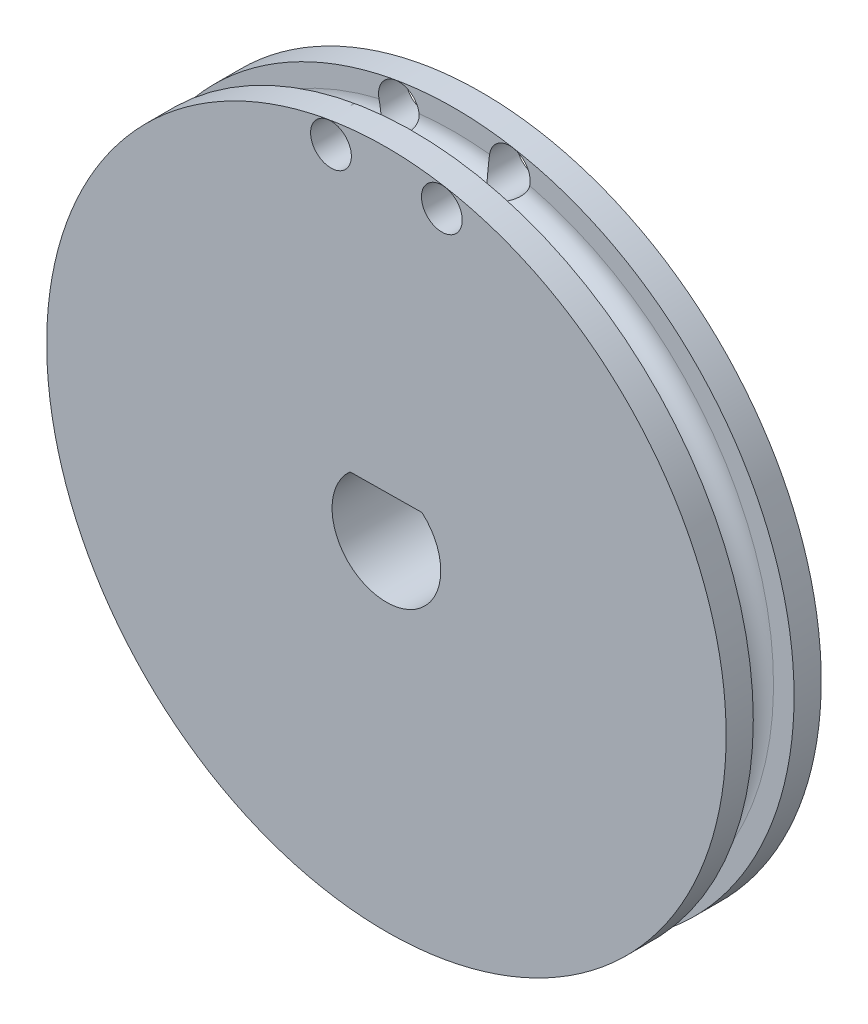
ISO-10303-21;
HEADER;
FILE_DESCRIPTION(('STEP AP214'),'2;1');
FILE_NAME('part.step','',(''),(''),'','','');
FILE_SCHEMA(('AUTOMOTIVE_DESIGN { 1 0 10303 214 1 1 1 1 }'));
ENDSEC;
DATA;
#1=APPLICATION_CONTEXT('core data for automotive mechanical design processes');
#2=APPLICATION_PROTOCOL_DEFINITION('international standard','automotive_design',2000,#1);
#3=PRODUCT_CONTEXT('',#1,'mechanical');
#4=PRODUCT('Part','Part','',(#3));
#5=PRODUCT_RELATED_PRODUCT_CATEGORY('part','',(#4));
#6=PRODUCT_DEFINITION_FORMATION('','',#4);
#7=PRODUCT_DEFINITION_CONTEXT('part definition',#1,'design');
#8=PRODUCT_DEFINITION('design','',#6,#7);
#9=PRODUCT_DEFINITION_SHAPE('','',#8);
#10=(LENGTH_UNIT() NAMED_UNIT(*) SI_UNIT(.MILLI.,.METRE.));
#11=(NAMED_UNIT(*) PLANE_ANGLE_UNIT() SI_UNIT($,.RADIAN.));
#12=(NAMED_UNIT(*) SI_UNIT($,.STERADIAN.) SOLID_ANGLE_UNIT());
#13=UNCERTAINTY_MEASURE_WITH_UNIT(LENGTH_MEASURE(1.E-05),#10,'distance_accuracy_value','');
#14=(GEOMETRIC_REPRESENTATION_CONTEXT(3) GLOBAL_UNCERTAINTY_ASSIGNED_CONTEXT((#13)) GLOBAL_UNIT_ASSIGNED_CONTEXT((#10,
#11,#12)) REPRESENTATION_CONTEXT('',''));
#15=CARTESIAN_POINT('',(0.,0.,0.));
#16=DIRECTION('',(0.,0.,1.));
#17=DIRECTION('',(1.,0.,0.));
#18=AXIS2_PLACEMENT_3D('',#15,#16,#17);
#19=CARTESIAN_POINT('',(0.,0.,0.072036914945138));
#20=DIRECTION('',(0.,0.,1.));
#21=DIRECTION('',(1.,0.,0.));
#22=AXIS2_PLACEMENT_3D('',#19,#20,#21);
#23=TOROIDAL_SURFACE('',#22,23.49,1.5);
#24=CARTESIAN_POINT('',(0.,0.,-1.42796308505486));
#25=DIRECTION('',(0.,0.,1.));
#26=DIRECTION('',(1.,0.,0.));
#27=AXIS2_PLACEMENT_3D('',#24,#25,#26);
#28=CIRCLE('',#27,23.49);
#29=CARTESIAN_POINT('',(-5.54713769197944,22.8256295296805,-1.42796308505486));
#30=VERTEX_POINT('',#29);
#31=CARTESIAN_POINT('',(5.54713769197964,22.8256295296813,-1.42796308505486));
#32=VERTEX_POINT('',#31);
#33=EDGE_CURVE('E110',#30,#32,#28,.T.);
#34=ORIENTED_EDGE('',*,*,#33,.T.);
#35=CARTESIAN_POINT('',(5.53587727955703,23.4902,-1.28282523331475));
#36=CARTESIAN_POINT('',(5.54296988954583,23.4612577675337,-1.29543508731334));
#37=CARTESIAN_POINT('',(5.54926513448115,23.4318414872527,-1.30739075382882));
#38=CARTESIAN_POINT('',(5.56014559001883,23.3721291733829,-1.3298635084857));
#39=CARTESIAN_POINT('',(5.56472940271165,23.34183244231,-1.34037941620202));
#40=CARTESIAN_POINT('',(5.57574755035601,23.2496067879141,-1.36960251723841));
#41=CARTESIAN_POINT('',(5.57940320750865,23.1865225117294,-1.38590534535933));
#42=CARTESIAN_POINT('',(5.57851359601544,23.0585896128547,-1.4109998918205));
#43=CARTESIAN_POINT('',(5.57392826223024,22.9937338883876,-1.41975460722039));
#44=CARTESIAN_POINT('',(5.55621707533469,22.8647342078331,-1.42882508482921));
#45=CARTESIAN_POINT('',(5.54311302305261,22.8005888587861,-1.42916230227391));
#46=CARTESIAN_POINT('',(5.50999335384375,22.6793411032209,-1.42158781258805));
#47=CARTESIAN_POINT('',(5.49050852649365,22.62205642535,-1.41423567121649));
#48=CARTESIAN_POINT('',(5.44535854027114,22.5113363926003,-1.39257744338744));
#49=CARTESIAN_POINT('',(5.41968752106894,22.4579047505302,-1.37826474986163));
#50=CARTESIAN_POINT('',(5.36267660035387,22.3548609879855,-1.34312765788525));
#51=CARTESIAN_POINT('',(5.33122514745139,22.3053577553524,-1.32216788666088));
#52=CARTESIAN_POINT('',(5.26426826944067,22.212029737362,-1.27489974194297));
#53=CARTESIAN_POINT('',(5.22876187285828,22.1682063181529,-1.24859008555276));
#54=CARTESIAN_POINT('',(5.13498252900141,22.0644641762039,-1.17641006770837));
#55=CARTESIAN_POINT('',(5.07466933075333,22.008431310042,-1.12759226735275));
#56=CARTESIAN_POINT('',(4.94984946741378,21.9092042260006,-1.02273167910773));
#57=CARTESIAN_POINT('',(4.88533179615433,21.8660455007917,-0.966669517309491));
#58=CARTESIAN_POINT('',(4.72690271071568,21.7760738682272,-0.825326797982623));
#59=CARTESIAN_POINT('',(4.63188124646892,21.7351465489062,-0.73755929116025));
#60=CARTESIAN_POINT('',(4.44079697214819,21.6739643568223,-0.556346515323248));
#61=CARTESIAN_POINT('',(4.34473341788815,21.6537253957179,-0.462896934592875));
#62=CARTESIAN_POINT('',(4.17727404012214,21.6346127931683,-0.29661562026875));
#63=CARTESIAN_POINT('',(4.10566591269968,21.6316868091401,-0.224414824434202));
#64=CARTESIAN_POINT('',(3.96368171012444,21.6358913289204,-0.0793042813436796));
#65=CARTESIAN_POINT('',(3.89330361838324,21.6430034211187,-0.00639607500957681));
#66=CARTESIAN_POINT('',(3.82206016996136,21.655302143156,0.0683257341572568));
#67=CARTESIAN_POINT('',(3.82029150239289,21.6556107342101,0.0701813419917548));
#68=CARTESIAN_POINT('',(3.81852342689566,21.6559224887385,0.072036914945138));
#69=B_SPLINE_CURVE_WITH_KNOTS('',3,(#35,#36,#37,#38,#39,#40,#41,#42,#43,#44,#45,#46,#47,#48,#49,
#50,#51,#52,#53,#54,#55,#56,#57,#58,#59,#60,#61,#62,#63,#64,#65,#66,#67,#68),.UNSPECIFIED.,.F.,
.F.,(4,2,2,2,2,2,2,2,2,2,2,2,2,2,2,2,4),(0.,0.097033725119664,0.194146535550287,
0.388972216130052,0.584747642266812,0.780024008226011,0.962016863528966,1.14418280756407,
1.33032676337095,1.51651540904874,1.80203315203328,2.08833091350429,2.49316653689112,
2.89831329035407,3.2030365612714,3.50720164150368,3.51494761423234),.UNSPECIFIED.);
#70=CARTESIAN_POINT('',(3.81852342689566,21.6559224887385,0.072036914945138));
#71=VERTEX_POINT('',#70);
#72=EDGE_CURVE('E173',#32,#71,#69,.T.);
#73=ORIENTED_EDGE('',*,*,#72,.T.);
#74=CARTESIAN_POINT('',(3.81852342689566,21.6559224887385,0.072036914945138));
#75=CARTESIAN_POINT('',(3.82029146213209,21.6556107471324,0.0738924446827287));
#76=CARTESIAN_POINT('',(3.82206012998036,21.6553021558237,0.0757480528489124));
#77=CARTESIAN_POINT('',(3.93867897884409,21.6351699203225,0.198060715299536));
#78=CARTESIAN_POINT('',(4.05616589076384,21.6286296876443,0.318811872192219));
#79=CARTESIAN_POINT('',(4.23378760420841,21.639959190087,0.497032114805131));
#80=CARTESIAN_POINT('',(4.29332098013085,21.647287108541,0.556044495245804));
#81=CARTESIAN_POINT('',(4.4124706036428,21.669419304703,0.672548366523577));
#82=CARTESIAN_POINT('',(4.47208677171208,21.6842186963164,0.730040825513147));
#83=CARTESIAN_POINT('',(4.60924884120185,21.7276127405149,0.860234267873168));
#84=CARTESIAN_POINT('',(4.68665808148888,21.759053296873,0.932161651550996));
#85=CARTESIAN_POINT('',(4.839019760022,21.8371149705561,1.07002745782826));
#86=CARTESIAN_POINT('',(4.91397733793056,21.8837017452553,1.13597900151308));
#87=CARTESIAN_POINT('',(5.04073635671208,21.9800040121342,1.24349169518864));
#88=CARTESIAN_POINT('',(5.09364544180589,22.0260320371978,1.28703054405928));
#89=CARTESIAN_POINT('',(5.19487390450964,22.1281636021159,1.36715517889373));
#90=CARTESIAN_POINT('',(5.24319905628782,22.1842542018695,1.40374977198521));
#91=CARTESIAN_POINT('',(5.32400149488492,22.2942955612163,1.46136067365825));
#92=CARTESIAN_POINT('',(5.35772062744923,22.3464619745528,1.48402731058987));
#93=CARTESIAN_POINT('',(5.41925222813132,22.4566124678633,1.52217863205728));
#94=CARTESIAN_POINT('',(5.44706867878494,22.514592586193,1.53766816738368));
#95=CARTESIAN_POINT('',(5.49552510641112,22.6354366175006,1.56048986189772));
#96=CARTESIAN_POINT('',(5.51612239825048,22.6983269766826,1.56777404733904));
#97=CARTESIAN_POINT('',(5.54884327577864,22.8266582527268,1.57349808433598));
#98=CARTESIAN_POINT('',(5.56096955890813,22.8920983506563,1.57194075275709));
#99=CARTESIAN_POINT('',(5.57570498397596,23.0171238078415,1.56079146625996));
#100=CARTESIAN_POINT('',(5.57909072791022,23.0766907897239,1.55195606402965));
#101=CARTESIAN_POINT('',(5.578896597277,23.1945139686135,1.52787218168111));
#102=CARTESIAN_POINT('',(5.57531409538923,23.2527696628328,1.51262128435198));
#103=CARTESIAN_POINT('',(5.56489513650583,23.3406901984014,1.4848430126624));
#104=CARTESIAN_POINT('',(5.56028913368249,23.371272539164,1.47424787242359));
#105=CARTESIAN_POINT('',(5.54934647475379,23.4314622950732,1.45161886659602));
#106=CARTESIAN_POINT('',(5.54301579855382,23.4610726898893,1.43959005154551));
#107=CARTESIAN_POINT('',(5.53587727955711,23.4902,1.42689906320502));
#108=B_SPLINE_CURVE_WITH_KNOTS('',3,(#74,#75,#76,#77,#78,#79,#80,#81,#82,#83,#84,#85,#86,#87,
#88,#89,#90,#91,#92,#93,#94,#95,#96,#97,#98,#99,#100,#101,#102,#103,#104,#105,#106,#107),
.UNSPECIFIED.,.F.,.F.,(4,2,2,2,2,2,2,2,2,2,2,2,2,2,2,2,4),(0.,0.0077459727286582,
0.510557627871253,0.762753922510325,1.01478550240646,1.34449093411415,1.67345394339158,
1.92025573776961,2.16674239993302,2.36431360073371,2.56175107352495,2.76033699657929,
2.95885965464949,3.13901836788079,3.3192450216535,3.41724080543281,3.51490104337425),.UNSPECIFIED.);
#109=CARTESIAN_POINT('',(5.54713769197951,22.8256295296805,1.57203691494514));
#110=VERTEX_POINT('',#109);
#111=EDGE_CURVE('E170',#71,#110,#108,.T.);
#112=ORIENTED_EDGE('',*,*,#111,.T.);
#113=CARTESIAN_POINT('',(0.,0.,1.57203691494514));
#114=DIRECTION('',(0.,0.,1.));
#115=DIRECTION('',(1.,0.,0.));
#116=AXIS2_PLACEMENT_3D('',#113,#114,#115);
#117=CIRCLE('',#116,23.49);
#118=CARTESIAN_POINT('',(-5.5471376919795,22.8256295296805,1.57203691494514));
#119=VERTEX_POINT('',#118);
#120=EDGE_CURVE('E111',#119,#110,#117,.T.);
#121=ORIENTED_EDGE('',*,*,#120,.F.);
#122=CARTESIAN_POINT('',(-5.53587727955702,23.4902,1.42689906320503));
#123=CARTESIAN_POINT('',(-5.54296988954582,23.4612577675337,1.43950891720362));
#124=CARTESIAN_POINT('',(-5.54926513448114,23.4318414872527,1.4514645837191));
#125=CARTESIAN_POINT('',(-5.56014559001882,23.3721291733829,1.47393733837598));
#126=CARTESIAN_POINT('',(-5.56472940271164,23.34183244231,1.4844532460923));
#127=CARTESIAN_POINT('',(-5.575747550356,23.2496067879141,1.51367634712869));
#128=CARTESIAN_POINT('',(-5.57940320750864,23.1865225117294,1.52997917524961));
#129=CARTESIAN_POINT('',(-5.57851359601543,23.0585896128547,1.55507372171077));
#130=CARTESIAN_POINT('',(-5.57392826223023,22.9937338883876,1.56382843711066));
#131=CARTESIAN_POINT('',(-5.55621707533468,22.8647342078331,1.57289891471948));
#132=CARTESIAN_POINT('',(-5.5431130230526,22.8005888587861,1.57323613216419));
#133=CARTESIAN_POINT('',(-5.50999335384374,22.6793411032209,1.56566164247833));
#134=CARTESIAN_POINT('',(-5.49050852649364,22.62205642535,1.55830950110677));
#135=CARTESIAN_POINT('',(-5.44535854027113,22.5113363926003,1.53665127327772));
#136=CARTESIAN_POINT('',(-5.41968752106893,22.4579047505302,1.52233857975191));
#137=CARTESIAN_POINT('',(-5.36267660035386,22.3548609879855,1.48720148777553));
#138=CARTESIAN_POINT('',(-5.33122514745138,22.3053577553524,1.46624171655115));
#139=CARTESIAN_POINT('',(-5.26426826944066,22.212029737362,1.41897357183324));
#140=CARTESIAN_POINT('',(-5.22876187285827,22.1682063181529,1.39266391544303));
#141=CARTESIAN_POINT('',(-5.1349825290014,22.0644641762039,1.32048389759864));
#142=CARTESIAN_POINT('',(-5.07466933075333,22.008431310042,1.27166609724301));
#143=CARTESIAN_POINT('',(-4.94984946741375,21.9092042260006,1.16680550899801));
#144=CARTESIAN_POINT('',(-4.88533179615428,21.8660455007917,1.11074334719979));
#145=CARTESIAN_POINT('',(-4.72690271071571,21.7760738682272,0.969400627872851));
#146=CARTESIAN_POINT('',(-4.63188124646913,21.7351465489061,0.881633121050319));
#147=CARTESIAN_POINT('',(-4.44079697214797,21.6739643568223,0.700420345213733));
#148=CARTESIAN_POINT('',(-4.34473341788733,21.653725395718,0.606970764483936));
#149=CARTESIAN_POINT('',(-4.17727404012271,21.6346127931682,0.440689450158441));
#150=CARTESIAN_POINT('',(-4.10566591270163,21.6316868091398,0.368488654322538));
#151=CARTESIAN_POINT('',(-3.96368171012245,21.6358913289207,0.223378111235897));
#152=CARTESIAN_POINT('',(-3.89330361837594,21.64300342112,0.150469904907019));
#153=CARTESIAN_POINT('',(-3.82206016996099,21.655302143156,0.0757480957333822));
#154=CARTESIAN_POINT('',(-3.8202915023927,21.6556107342101,0.0738924878987068));
#155=CARTESIAN_POINT('',(-3.81852342689565,21.6559224887385,0.072036914945138));
#156=B_SPLINE_CURVE_WITH_KNOTS('',3,(#122,#123,#124,#125,#126,#127,#128,#129,#130,#131,#132,
#133,#134,#135,#136,#137,#138,#139,#140,#141,#142,#143,#144,#145,#146,#147,#148,#149,#150,#151,
#152,#153,#154,#155),.UNSPECIFIED.,.F.,.F.,(4,2,2,2,2,2,2,2,2,2,2,2,2,2,2,2,4),(0.,
0.0970337251196675,0.194146535550291,0.388972216130052,0.584747642266805,0.780024008226011,
0.962016863528967,1.14418280756407,1.33032676337094,1.51651540904874,1.80203315203329,
2.0883309135043,2.4931665368911,2.89831329035408,3.2030365612714,3.50720164150367,
3.51494761423234),.UNSPECIFIED.);
#157=CARTESIAN_POINT('',(-3.81852342689565,21.6559224887385,0.072036914945138));
#158=VERTEX_POINT('',#157);
#159=EDGE_CURVE('E49',#119,#158,#156,.T.);
#160=ORIENTED_EDGE('',*,*,#159,.T.);
#161=CARTESIAN_POINT('',(-3.81852342689565,21.6559224887385,0.072036914945138));
#162=CARTESIAN_POINT('',(-3.82029146213221,21.6556107471324,0.0701813852076732));
#163=CARTESIAN_POINT('',(-3.82206012998061,21.6553021558237,0.068325777041612));
#164=CARTESIAN_POINT('',(-3.93867897885207,21.6351699203212,-0.0539868854008861));
#165=CARTESIAN_POINT('',(-4.05616589076479,21.6286296876441,-0.174738042299887));
#166=CARTESIAN_POINT('',(-4.23378760420664,21.639959190087,-0.352958284914605));
#167=CARTESIAN_POINT('',(-4.29332098012948,21.6472871085409,-0.41197066535459));
#168=CARTESIAN_POINT('',(-4.41247060364154,21.6694193047026,-0.52847453663169));
#169=CARTESIAN_POINT('',(-4.47208677171053,21.684218696316,-0.585966995621275));
#170=CARTESIAN_POINT('',(-4.60924884120018,21.7276127405143,-0.716160437981501));
#171=CARTESIAN_POINT('',(-4.68665808148744,21.7590532968724,-0.78808782165945));
#172=CARTESIAN_POINT('',(-4.83901976002095,21.8371149705555,-0.925953627937026));
#173=CARTESIAN_POINT('',(-4.91397733792967,21.8837017452547,-0.991905171622045));
#174=CARTESIAN_POINT('',(-5.04073635671138,21.9800040121336,-1.0994178652978));
#175=CARTESIAN_POINT('',(-5.09364544180522,22.0260320371972,-1.14295671416848));
#176=CARTESIAN_POINT('',(-5.19487390450904,22.1281636021152,-1.22308134900299));
#177=CARTESIAN_POINT('',(-5.24319905628725,22.1842542018688,-1.25967594209451));
#178=CARTESIAN_POINT('',(-5.32400149488442,22.2942955612156,-1.31728684376763));
#179=CARTESIAN_POINT('',(-5.35772062744876,22.3464619745521,-1.33995348069929));
#180=CARTESIAN_POINT('',(-5.41925222813093,22.4566124678626,-1.37810480216679));
#181=CARTESIAN_POINT('',(-5.44706867878459,22.5145925861923,-1.39359433749322));
#182=CARTESIAN_POINT('',(-5.49552510641085,22.6354366174999,-1.41641603200734));
#183=CARTESIAN_POINT('',(-5.51612239825025,22.6983269766818,-1.4237002174487));
#184=CARTESIAN_POINT('',(-5.54884327577848,22.8266582527261,-1.4294242544457));
#185=CARTESIAN_POINT('',(-5.56096955890802,22.8920983506556,-1.42786692286685));
#186=CARTESIAN_POINT('',(-5.5757049839759,23.0171238078408,-1.41671763636977));
#187=CARTESIAN_POINT('',(-5.57909072791019,23.0766907897233,-1.40788223413948));
#188=CARTESIAN_POINT('',(-5.57889659727701,23.1945139686129,-1.38379835179099));
#189=CARTESIAN_POINT('',(-5.57531409538927,23.2527696628322,-1.36854745446187));
#190=CARTESIAN_POINT('',(-5.5648951365059,23.3406901984009,-1.34076918277229));
#191=CARTESIAN_POINT('',(-5.56028913368254,23.3712725391636,-1.33017404253346));
#192=CARTESIAN_POINT('',(-5.54934647475383,23.431462295073,-1.30754503670582));
#193=CARTESIAN_POINT('',(-5.54301579855384,23.4610726898892,-1.29551622165528));
#194=CARTESIAN_POINT('',(-5.5358772795571,23.4902,-1.28282523331474));
#195=B_SPLINE_CURVE_WITH_KNOTS('',3,(#161,#162,#163,#164,#165,#166,#167,#168,#169,#170,#171,
#172,#173,#174,#175,#176,#177,#178,#179,#180,#181,#182,#183,#184,#185,#186,#187,#188,#189,#190,
#191,#192,#193,#194),.UNSPECIFIED.,.F.,.F.,(4,2,2,2,2,2,2,2,2,2,2,2,2,2,2,2,4),(0.,
0.00774597272865799,0.510557627870059,0.762753922508485,1.014785502404,1.34449093411236,
1.67345394339051,1.9202557377686,2.16674239993204,2.36431360073282,2.56175107352413,
2.76033699657855,2.95885965464883,3.13901836788014,3.31924502165287,3.41724080543249,
3.51490104337425),.UNSPECIFIED.);
#196=EDGE_CURVE('E107',#158,#30,#195,.T.);
#197=ORIENTED_EDGE('',*,*,#196,.T.);
#198=EDGE_LOOP('',(#34,#73,#112,#121,#160,#197));
#199=FACE_BOUND('',#198,.T.);
#200=ADVANCED_FACE('F34',(#199),#23,.F.);
#201=CARTESIAN_POINT('',(0.,0.,3.57203691494513));
#202=DIRECTION('',(0.,0.,-1.));
#203=DIRECTION('',(-1.,0.,0.));
#204=AXIS2_PLACEMENT_3D('',#201,#202,#203);
#205=PLANE('',#204);
#206=CARTESIAN_POINT('',(4.07899569339604,23.1331341182568,3.57203691494513));
#207=DIRECTION('',(0.,0.,-1.));
#208=DIRECTION('',(-1.,0.,0.));
#209=AXIS2_PLACEMENT_3D('',#206,#207,#208);
#210=CIRCLE('',#209,1.5);
#211=CARTESIAN_POINT('',(2.57899569339604,23.1331341182568,3.57203691494513));
#212=VERTEX_POINT('',#211);
#213=EDGE_CURVE('E206',#212,#212,#210,.T.);
#214=ORIENTED_EDGE('',*,*,#213,.T.);
#215=EDGE_LOOP('',(#214));
#216=FACE_BOUND('',#215,.T.);
#217=CARTESIAN_POINT('',(-4.07899569339603,23.1331341182568,3.57203691494513));
#218=DIRECTION('',(0.,0.,-1.));
#219=DIRECTION('',(-1.,0.,0.));
#220=AXIS2_PLACEMENT_3D('',#217,#218,#219);
#221=CIRCLE('',#220,1.5);
#222=CARTESIAN_POINT('',(-5.57899569339603,23.1331341182568,3.57203691494513));
#223=VERTEX_POINT('',#222);
#224=EDGE_CURVE('E175',#223,#223,#221,.T.);
#225=ORIENTED_EDGE('',*,*,#224,.T.);
#226=EDGE_LOOP('',(#225));
#227=FACE_BOUND('',#226,.T.);
#228=DIRECTION('',(0.999941658436289,0.0108018389028612,0.));
#229=VECTOR('',#228,1.);
#230=CARTESIAN_POINT('',(-0.0324055167085836,2.99982497530887,3.57203691494513));
#231=LINE('',#230,#229);
#232=CARTESIAN_POINT('',(-2.6780024705045,2.97124599586971,3.57203691494513));
#233=VERTEX_POINT('',#232);
#234=CARTESIAN_POINT('',(2.61319143708733,3.02840395474802,3.57203691494513));
#235=VERTEX_POINT('',#234);
#236=EDGE_CURVE('E217',#233,#235,#231,.T.);
#237=ORIENTED_EDGE('',*,*,#236,.T.);
#238=CARTESIAN_POINT('',(0.,0.,3.57203691494513));
#239=DIRECTION('',(0.,0.,-1.));
#240=DIRECTION('',(-1.,0.,0.));
#241=AXIS2_PLACEMENT_3D('',#238,#239,#240);
#242=CIRCLE('',#241,4.);
#243=EDGE_CURVE('E222',#235,#233,#242,.T.);
#244=ORIENTED_EDGE('',*,*,#243,.T.);
#245=EDGE_LOOP('',(#237,#244));
#246=FACE_BOUND('',#245,.T.);
#247=CARTESIAN_POINT('',(0.,0.,3.57203691494513));
#248=DIRECTION('',(0.,0.,1.));
#249=DIRECTION('',(1.,0.,0.));
#250=AXIS2_PLACEMENT_3D('',#247,#248,#249);
#251=CIRCLE('',#250,25.);
#252=CARTESIAN_POINT('',(25.,0.,3.57203691494513));
#253=VERTEX_POINT('',#252);
#254=EDGE_CURVE('E224',#253,#253,#251,.T.);
#255=ORIENTED_EDGE('',*,*,#254,.T.);
#256=EDGE_LOOP('',(#255));
#257=FACE_BOUND('',#256,.T.);
#258=ADVANCED_FACE('F36',(#216,#227,#246,#257),#205,.F.);
#259=CARTESIAN_POINT('',(0.,0.,-3.42796308505486));
#260=DIRECTION('',(0.,0.,1.));
#261=DIRECTION('',(1.,0.,0.));
#262=AXIS2_PLACEMENT_3D('',#259,#260,#261);
#263=PLANE('',#262);
#264=CARTESIAN_POINT('',(4.07899569339604,23.1331341182568,-3.42796308505486));
#265=DIRECTION('',(0.,0.,-1.));
#266=DIRECTION('',(-1.,0.,0.));
#267=AXIS2_PLACEMENT_3D('',#264,#265,#266);
#268=CIRCLE('',#267,1.5);
#269=CARTESIAN_POINT('',(2.57899569339604,23.1331341182568,-3.42796308505486));
#270=VERTEX_POINT('',#269);
#271=EDGE_CURVE('E266',#270,#270,#268,.T.);
#272=ORIENTED_EDGE('',*,*,#271,.F.);
#273=EDGE_LOOP('',(#272));
#274=FACE_BOUND('',#273,.T.);
#275=CARTESIAN_POINT('',(-4.07899569339603,23.1331341182568,-3.42796308505486));
#276=DIRECTION('',(0.,0.,-1.));
#277=DIRECTION('',(-1.,0.,0.));
#278=AXIS2_PLACEMENT_3D('',#275,#276,#277);
#279=CIRCLE('',#278,1.5);
#280=CARTESIAN_POINT('',(-5.57899569339603,23.1331341182568,-3.42796308505486));
#281=VERTEX_POINT('',#280);
#282=EDGE_CURVE('E263',#281,#281,#279,.T.);
#283=ORIENTED_EDGE('',*,*,#282,.F.);
#284=EDGE_LOOP('',(#283));
#285=FACE_BOUND('',#284,.T.);
#286=DIRECTION('',(0.999941658436289,0.0108018389028612,0.));
#287=VECTOR('',#286,1.);
#288=CARTESIAN_POINT('',(2.61319143708733,3.02840395474802,-3.42796308505486));
#289=LINE('',#288,#287);
#290=CARTESIAN_POINT('',(-2.6780024705045,2.97124599586971,-3.42796308505486));
#291=VERTEX_POINT('',#290);
#292=CARTESIAN_POINT('',(2.61319143708733,3.02840395474802,-3.42796308505486));
#293=VERTEX_POINT('',#292);
#294=EDGE_CURVE('E211',#291,#293,#289,.T.);
#295=ORIENTED_EDGE('',*,*,#294,.F.);
#296=CARTESIAN_POINT('',(0.,0.,-3.42796308505486));
#297=DIRECTION('',(0.,0.,-1.));
#298=DIRECTION('',(-1.,0.,0.));
#299=AXIS2_PLACEMENT_3D('',#296,#297,#298);
#300=CIRCLE('',#299,4.);
#301=EDGE_CURVE('E209',#293,#291,#300,.T.);
#302=ORIENTED_EDGE('',*,*,#301,.F.);
#303=EDGE_LOOP('',(#295,#302));
#304=FACE_BOUND('',#303,.T.);
#305=CARTESIAN_POINT('',(0.,0.,-3.42796308505486));
#306=DIRECTION('',(0.,0.,1.));
#307=DIRECTION('',(1.,0.,0.));
#308=AXIS2_PLACEMENT_3D('',#305,#306,#307);
#309=CIRCLE('',#308,25.);
#310=CARTESIAN_POINT('',(25.,0.,-3.42796308505486));
#311=VERTEX_POINT('',#310);
#312=EDGE_CURVE('E100',#311,#311,#309,.T.);
#313=ORIENTED_EDGE('',*,*,#312,.F.);
#314=EDGE_LOOP('',(#313));
#315=FACE_BOUND('',#314,.T.);
#316=ADVANCED_FACE('F128',(#274,#285,#304,#315),#263,.F.);
#317=CARTESIAN_POINT('',(0.,0.,3.57203691494513));
#318=DIRECTION('',(0.,0.,1.));
#319=DIRECTION('',(1.,0.,0.));
#320=AXIS2_PLACEMENT_3D('',#317,#318,#319);
#321=CYLINDRICAL_SURFACE('',#320,25.);
#322=CARTESIAN_POINT('',(0.,0.,-1.42796308505486));
#323=DIRECTION('',(0.,0.,1.));
#324=DIRECTION('',(1.,0.,0.));
#325=AXIS2_PLACEMENT_3D('',#322,#323,#324);
#326=CIRCLE('',#325,25.);
#327=CARTESIAN_POINT('',(25.,0.,-1.42796308505486));
#328=VERTEX_POINT('',#327);
#329=EDGE_CURVE('E120',#328,#328,#326,.T.);
#330=ORIENTED_EDGE('',*,*,#329,.F.);
#331=EDGE_LOOP('',(#330));
#332=FACE_BOUND('',#331,.T.);
#333=ORIENTED_EDGE('',*,*,#312,.T.);
#334=EDGE_LOOP('',(#333));
#335=FACE_BOUND('',#334,.T.);
#336=ADVANCED_FACE('F126',(#332,#335),#321,.T.);
#337=CARTESIAN_POINT('',(0.,23.49,-1.42796308505486));
#338=DIRECTION('',(0.,0.,-1.));
#339=DIRECTION('',(-1.,0.,0.));
#340=AXIS2_PLACEMENT_3D('',#337,#338,#339);
#341=PLANE('',#340);
#342=CARTESIAN_POINT('',(2.59422072760315,23.3463084622917,-1.42796308505486));
#343=VERTEX_POINT('',#342);
#344=CARTESIAN_POINT('',(-2.59422072760314,23.3463084622917,-1.42796308505486));
#345=VERTEX_POINT('',#344);
#346=EDGE_CURVE('E114',#343,#345,#28,.T.);
#347=ORIENTED_EDGE('',*,*,#346,.F.);
#348=CARTESIAN_POINT('',(4.07899569339604,23.1331341182568,-1.42796308505486));
#349=DIRECTION('',(0.,0.,-1.));
#350=DIRECTION('',(-1.,0.,0.));
#351=AXIS2_PLACEMENT_3D('',#348,#349,#350);
#352=CIRCLE('',#351,1.5);
#353=EDGE_CURVE('E165',#343,#32,#352,.T.);
#354=ORIENTED_EDGE('',*,*,#353,.T.);
#355=ORIENTED_EDGE('',*,*,#33,.F.);
#356=CARTESIAN_POINT('',(-4.07899569339603,23.1331341182568,-1.42796308505486));
#357=DIRECTION('',(0.,0.,-1.));
#358=DIRECTION('',(-1.,0.,0.));
#359=AXIS2_PLACEMENT_3D('',#356,#357,#358);
#360=CIRCLE('',#359,1.5);
#361=EDGE_CURVE('E166',#30,#345,#360,.T.);
#362=ORIENTED_EDGE('',*,*,#361,.T.);
#363=EDGE_LOOP('',(#347,#354,#355,#362));
#364=FACE_BOUND('',#363,.T.);
#365=ORIENTED_EDGE('',*,*,#329,.T.);
#366=EDGE_LOOP('',(#365));
#367=FACE_BOUND('',#366,.T.);
#368=ADVANCED_FACE('F135',(#364,#367),#341,.F.);
#369=CARTESIAN_POINT('',(2.62211410723505,23.4902,1.5649053964279));
#370=CARTESIAN_POINT('',(2.61455640634886,23.4593929494835,1.56799061938964));
#371=CARTESIAN_POINT('',(2.60796626580762,23.4282484290934,1.57008058271915));
#372=CARTESIAN_POINT('',(2.59676947387959,23.3655433476069,1.5722466225683));
#373=CARTESIAN_POINT('',(2.59216236234651,23.3339828847803,1.57232316653414));
#374=CARTESIAN_POINT('',(2.5849990782557,23.2708896385209,1.57044638422297));
#375=CARTESIAN_POINT('',(2.58243016840764,23.2393579331999,1.56850584230761));
#376=CARTESIAN_POINT('',(2.57928748618867,23.1763884680157,1.56264762909491));
#377=CARTESIAN_POINT('',(2.57871369031481,23.1449507070503,1.55872998108901));
#378=CARTESIAN_POINT('',(2.57993779174684,23.0511678782124,1.54409594114684));
#379=CARTESIAN_POINT('',(2.58467180974066,22.9892683507479,1.53049572056287));
#380=CARTESIAN_POINT('',(2.60127760476828,22.8683844608095,1.49646315395965));
#381=CARTESIAN_POINT('',(2.61315918194368,22.8094042214094,1.47602144456095));
#382=CARTESIAN_POINT('',(2.64749999818394,22.6785538912443,1.42249024675282));
#383=CARTESIAN_POINT('',(2.67204853722153,22.6080318470344,1.38744814077708));
#384=CARTESIAN_POINT('',(2.72925092827444,22.4747459044345,1.31004690526786));
#385=CARTESIAN_POINT('',(2.76191860790557,22.4119955178949,1.26767533081735));
#386=CARTESIAN_POINT('',(2.84747568193888,22.271433593207,1.15990231902865));
#387=CARTESIAN_POINT('',(2.90327497883626,22.197342553483,1.09197879293338));
#388=CARTESIAN_POINT('',(3.02325440696205,22.0637879169408,0.949383914962599));
#389=CARTESIAN_POINT('',(3.08745541349165,22.0043618554455,0.874695902961962));
#390=CARTESIAN_POINT('',(3.20462239943972,21.9126842820127,0.740721052740086));
#391=CARTESIAN_POINT('',(3.25628744793057,21.8773661651044,0.682354212608842));
#392=CARTESIAN_POINT('',(3.36220977137896,21.8140316447099,0.564015850140915));
#393=CARTESIAN_POINT('',(3.41646875957292,21.7860201481691,0.50404327908758));
#394=CARTESIAN_POINT('',(3.58207009803567,21.7127064283682,0.322894169977842));
#395=CARTESIAN_POINT('',(3.69658056730599,21.6778655394064,0.200093569678482));
#396=CARTESIAN_POINT('',(3.81498784825707,21.6565491902506,0.0757480513350116));
#397=CARTESIAN_POINT('',(3.81675539683208,21.6562342512039,0.0738924431649166));
#398=CARTESIAN_POINT('',(3.81852342689566,21.6559224887385,0.072036914945138));
#399=B_SPLINE_CURVE_WITH_KNOTS('',3,(#369,#370,#371,#372,#373,#374,#375,#376,#377,#378,#379,
#380,#381,#382,#383,#384,#385,#386,#387,#388,#389,#390,#391,#392,#393,#394,#395,#396,#397,#398),
.UNSPECIFIED.,.F.,.F.,(4,2,2,2,2,2,2,2,2,2,2,2,2,2,4),(0.,0.0955795102823252,0.19113683011877,
0.286092175710775,0.381046402700286,0.570701977935234,0.760618187789394,1.00671362215991,
1.25323108586571,1.5962532364655,1.94014445960825,2.196484421564,2.45299609442553,
2.96429287520986,2.97203884793851),.UNSPECIFIED.);
#400=CARTESIAN_POINT('',(2.5942207276031,23.3463084622917,1.57203691494514));
#401=VERTEX_POINT('',#400);
#402=EDGE_CURVE('E57',#401,#71,#399,.T.);
#403=ORIENTED_EDGE('',*,*,#402,.T.);
#404=CARTESIAN_POINT('',(3.81852342689566,21.6559224887385,0.072036914945138));
#405=CARTESIAN_POINT('',(3.81675539532537,21.6562342511152,0.0701813852115622));
#406=CARTESIAN_POINT('',(3.81498784675595,21.6565491901706,0.0683257770454815));
#407=CARTESIAN_POINT('',(3.69851327124989,21.6775176258306,-0.0539901132546467));
#408=CARTESIAN_POINT('',(3.58587181772842,21.7115559845888,-0.17474452987681));
#409=CARTESIAN_POINT('',(3.42283578268776,21.7829541685921,-0.352966210149972));
#410=CARTESIAN_POINT('',(3.36940052475955,21.8102013202891,-0.411976959683293));
#411=CARTESIAN_POINT('',(3.26500909029244,21.8717490971573,-0.528477629399756));
#412=CARTESIAN_POINT('',(3.21405131701975,21.9060451027941,-0.585968517928592));
#413=CARTESIAN_POINT('',(3.10000839682037,21.9937299729121,-0.71615552860388));
#414=CARTESIAN_POINT('',(3.03802475966957,22.0497456978802,-0.788078232497306));
#415=CARTESIAN_POINT('',(2.92154930894407,22.1752089007235,-0.925944841657226));
#416=CARTESIAN_POINT('',(2.86704189751473,22.2446276633094,-0.991901093835996));
#417=CARTESIAN_POINT('',(2.78085969944182,22.3784831115387,-1.0994198823992));
#418=CARTESIAN_POINT('',(2.74688247863867,22.4398333234392,-1.14296050855546));
#419=CARTESIAN_POINT('',(2.68669082891289,22.5704308591222,-1.22308461523411));
#420=CARTESIAN_POINT('',(2.66046587031307,22.6396672924301,-1.2596775082577));
#421=CARTESIAN_POINT('',(2.62216469052037,22.7707252229979,-1.31729902404641));
#422=CARTESIAN_POINT('',(2.60831502753956,22.8312999207685,-1.33997481733479));
#423=CARTESIAN_POINT('',(2.58817761685026,22.9558803626519,-1.37812024887697));
#424=CARTESIAN_POINT('',(2.58187753232445,23.0198803301932,-1.39360161816859));
#425=CARTESIAN_POINT('',(2.5786917900164,23.1182279670231,-1.4108588760944));
#426=CARTESIAN_POINT('',(2.57873112186402,23.1519905066556,-1.41564377679354));
#427=CARTESIAN_POINT('',(2.58111285510599,23.219691717877,-1.42293771050327));
#428=CARTESIAN_POINT('',(2.58345533447282,23.2536303953902,-1.42544666645677));
#429=CARTESIAN_POINT('',(2.5904918204818,23.3216363566582,-1.4281487652134));
#430=CARTESIAN_POINT('',(2.59520499547906,23.3557024049163,-1.42832270548343));
#431=CARTESIAN_POINT('',(2.60694050095698,23.4233767885727,-1.4263286980778));
#432=CARTESIAN_POINT('',(2.61396359631808,23.4569849685137,-1.42415997413517));
#433=CARTESIAN_POINT('',(2.62211410723505,23.4902,-1.42083156653763));
#434=B_SPLINE_CURVE_WITH_KNOTS('',3,(#404,#405,#406,#407,#408,#409,#410,#411,#412,#413,#414,
#415,#416,#417,#418,#419,#420,#421,#422,#423,#424,#425,#426,#427,#428,#429,#430,#431,#432,#433),
.UNSPECIFIED.,.F.,.F.,(4,2,2,2,2,2,2,2,2,2,2,2,2,2,4),(0.,0.00774597272865822,0.510571100539468,
0.762760660259789,1.0147854691313,1.34446900509668,1.67345389618221,1.92026652576347,
2.16674235993027,2.36440844233663,2.56175107485624,2.66392033784326,2.76609305986454,
2.86910551260881,2.97215211010986),.UNSPECIFIED.);
#435=EDGE_CURVE('E168',#71,#343,#434,.T.);
#436=ORIENTED_EDGE('',*,*,#435,.T.);
#437=ORIENTED_EDGE('',*,*,#346,.T.);
#438=CARTESIAN_POINT('',(-2.62211410723504,23.4902,-1.42083156653763));
#439=CARTESIAN_POINT('',(-2.61455661344222,23.4593937903465,-1.42391670449847));
#440=CARTESIAN_POINT('',(-2.60796662632144,23.4282501305058,-1.42600663817052));
#441=CARTESIAN_POINT('',(-2.5967700306543,23.3655467814591,-1.42817272963424));
#442=CARTESIAN_POINT('',(-2.59216296228597,23.3339871904551,-1.42824935454281));
#443=CARTESIAN_POINT('',(-2.58499945838842,23.2708939597525,-1.42637279241637));
#444=CARTESIAN_POINT('',(-2.58243039554518,23.2393613889583,-1.42443227937044));
#445=CARTESIAN_POINT('',(-2.57928751748875,23.176390192522,-1.41857401428778));
#446=CARTESIAN_POINT('',(-2.57871367875771,23.1449515657769,-1.41465628555726));
#447=CARTESIAN_POINT('',(-2.57993782892369,23.0511650832969,-1.40002167441134));
#448=CARTESIAN_POINT('',(-2.58467223657535,22.9892628096002,-1.38642067002588));
#449=CARTESIAN_POINT('',(-2.60127866747928,22.8683791725083,-1.35238749395236));
#450=CARTESIAN_POINT('',(-2.61315985346828,22.8094016641434,-1.33194656789517));
#451=CARTESIAN_POINT('',(-2.64749639174881,22.6785676310939,-1.27842203863585));
#452=CARTESIAN_POINT('',(-2.67203939529894,22.6080580940151,-1.2433873596966));
#453=CARTESIAN_POINT('',(-2.72923874835786,22.4747693143083,-1.16598887431011));
#454=CARTESIAN_POINT('',(-2.76191192373225,22.4120065121257,-1.12360992438025));
#455=CARTESIAN_POINT('',(-2.84751984133583,22.2713610258223,-1.01577285812917));
#456=CARTESIAN_POINT('',(-2.90337403147648,22.1972109524765,-0.947784362953545));
#457=CARTESIAN_POINT('',(-3.02336838226617,22.063682494053,-0.805177514163154));
#458=CARTESIAN_POINT('',(-3.08751481230124,22.0043153861096,-0.730554157696332));
#459=CARTESIAN_POINT('',(-3.2047219662721,21.9126063701894,-0.596533369700826));
#460=CARTESIAN_POINT('',(-3.25649326083942,21.8772254618838,-0.538047868900234));
#461=CARTESIAN_POINT('',(-3.36255624229787,21.8138422239165,-0.419557527500141));
#462=CARTESIAN_POINT('',(-3.41684574649405,21.7858336397304,-0.359554022430198));
#463=CARTESIAN_POINT('',(-3.58235225273989,21.7126207797452,-0.178517795304384));
#464=CARTESIAN_POINT('',(-3.6967239588646,21.6778397267664,-0.055869157295695));
#465=CARTESIAN_POINT('',(-3.81498784811715,21.6565491902527,0.0683257784127157));
#466=CARTESIAN_POINT('',(-3.81675539669132,21.6562342512055,0.0701813865820497));
#467=CARTESIAN_POINT('',(-3.81852342689565,21.6559224887385,0.072036914945138));
#468=B_SPLINE_CURVE_WITH_KNOTS('',3,(#438,#439,#440,#441,#442,#443,#444,#445,#446,#447,#448,
#449,#450,#451,#452,#453,#454,#455,#456,#457,#458,#459,#460,#461,#462,#463,#464,#465,#466,#467),
.UNSPECIFIED.,.F.,.F.,(4,2,2,2,2,2,2,2,2,2,2,2,2,2,4),(0.,0.0955769006025286,0.191131625778805,
0.286089573930423,0.381046402801493,0.570710451666117,0.760618184716033,1.0066678934617,
1.25323111444014,1.59655713109944,1.94014425595627,2.1969944308822,2.45362599201821,
2.9642942509645,2.97204022369316),.UNSPECIFIED.);
#469=EDGE_CURVE('E106',#345,#158,#468,.T.);
#470=ORIENTED_EDGE('',*,*,#469,.T.);
#471=CARTESIAN_POINT('',(-3.81852342689565,21.6559224887385,0.072036914945138));
#472=CARTESIAN_POINT('',(-3.81675539532543,21.6562342511152,0.0738924446787816));
#473=CARTESIAN_POINT('',(-3.81498784675608,21.6565491901706,0.0757480528449283));
#474=CARTESIAN_POINT('',(-3.69851327125417,21.6775176258299,0.198063943149436));
#475=CARTESIAN_POINT('',(-3.58587181772894,21.7115559845887,0.318818359768209));
#476=CARTESIAN_POINT('',(-3.42283578268685,21.7829541685924,0.497040040040401));
#477=CARTESIAN_POINT('',(-3.36940052475887,21.8102013202894,0.556050789574088));
#478=CARTESIAN_POINT('',(-3.26500909029187,21.8717490971577,0.672551459290905));
#479=CARTESIAN_POINT('',(-3.21405131701904,21.9060451027946,0.73004234781973));
#480=CARTESIAN_POINT('',(-3.10000839681963,21.9937299729127,0.860229358494903));
#481=CARTESIAN_POINT('',(-3.03802475966896,22.0497456978808,0.932152062388263));
#482=CARTESIAN_POINT('',(-2.92154930894366,22.175208900724,1.07001867154802));
#483=CARTESIAN_POINT('',(-2.86704189751439,22.2446276633099,1.13597492372669));
#484=CARTESIAN_POINT('',(-2.78085969944157,22.3784831115391,1.24349371228978));
#485=CARTESIAN_POINT('',(-2.74688247863844,22.4398333234397,1.28703433844602));
#486=CARTESIAN_POINT('',(-2.6866908289127,22.5704308591226,1.36715844512463));
#487=CARTESIAN_POINT('',(-2.6604658703129,22.6396672924306,1.4037513381482));
#488=CARTESIAN_POINT('',(-2.62216469052024,22.7707252229984,1.46137285393687));
#489=CARTESIAN_POINT('',(-2.60831502753945,22.8312999207689,1.48404864722523));
#490=CARTESIAN_POINT('',(-2.5881776168502,22.9558803626523,1.52219407876737));
#491=CARTESIAN_POINT('',(-2.58187753232441,23.0198803301937,1.53767544805896));
#492=CARTESIAN_POINT('',(-2.57869179001638,23.1182279670235,1.55493270598473));
#493=CARTESIAN_POINT('',(-2.57873112186402,23.151990506656,1.55971760668387));
#494=CARTESIAN_POINT('',(-2.581112855106,23.2196917178773,1.56701154039357));
#495=CARTESIAN_POINT('',(-2.58345533447283,23.2536303953905,1.56952049634707));
#496=CARTESIAN_POINT('',(-2.59049182048182,23.3216363566583,1.57222259510368));
#497=CARTESIAN_POINT('',(-2.59520499547908,23.3557024049164,1.57239653537371));
#498=CARTESIAN_POINT('',(-2.60694050095698,23.4233767885728,1.57040252796807));
#499=CARTESIAN_POINT('',(-2.61396359631808,23.4569849685137,1.56823380402544));
#500=CARTESIAN_POINT('',(-2.62211410723504,23.4902,1.5649053964279));
#501=B_SPLINE_CURVE_WITH_KNOTS('',3,(#471,#472,#473,#474,#475,#476,#477,#478,#479,#480,#481,
#482,#483,#484,#485,#486,#487,#488,#489,#490,#491,#492,#493,#494,#495,#496,#497,#498,#499,#500),
.UNSPECIFIED.,.F.,.F.,(4,2,2,2,2,2,2,2,2,2,2,2,2,2,4),(0.,0.0077459727286585,0.510571100540133,
0.762760660260783,1.01478546913262,1.34446900509762,1.67345389618278,1.92026652576402,
2.16674235993079,2.36440844233711,2.56175107485668,2.66392033784359,2.76609305986477,
2.86910551260892,2.97215211010986),.UNSPECIFIED.);
#502=CARTESIAN_POINT('',(-2.59422072760309,23.3463084622917,1.57203691494514));
#503=VERTEX_POINT('',#502);
#504=EDGE_CURVE('E94',#158,#503,#501,.T.);
#505=ORIENTED_EDGE('',*,*,#504,.T.);
#506=EDGE_CURVE('E104',#401,#503,#117,.T.);
#507=ORIENTED_EDGE('',*,*,#506,.F.);
#508=EDGE_LOOP('',(#403,#436,#437,#470,#505,#507));
#509=FACE_BOUND('',#508,.T.);
#510=ADVANCED_FACE('F103',(#509),#23,.F.);
#511=CARTESIAN_POINT('',(0.,25.,1.57203691494514));
#512=DIRECTION('',(0.,0.,1.));
#513=DIRECTION('',(1.,0.,0.));
#514=AXIS2_PLACEMENT_3D('',#511,#512,#513);
#515=PLANE('',#514);
#516=CARTESIAN_POINT('',(0.,0.,1.57203691494514));
#517=DIRECTION('',(0.,0.,1.));
#518=DIRECTION('',(1.,0.,0.));
#519=AXIS2_PLACEMENT_3D('',#516,#517,#518);
#520=CIRCLE('',#519,25.);
#521=CARTESIAN_POINT('',(25.,0.,1.57203691494514));
#522=VERTEX_POINT('',#521);
#523=EDGE_CURVE('E116',#522,#522,#520,.T.);
#524=ORIENTED_EDGE('',*,*,#523,.F.);
#525=EDGE_LOOP('',(#524));
#526=FACE_BOUND('',#525,.T.);
#527=ORIENTED_EDGE('',*,*,#120,.T.);
#528=CARTESIAN_POINT('',(4.07899569339604,23.1331341182568,1.57203691494514));
#529=DIRECTION('',(0.,0.,1.));
#530=DIRECTION('',(1.,0.,0.));
#531=AXIS2_PLACEMENT_3D('',#528,#529,#530);
#532=CIRCLE('',#531,1.5);
#533=EDGE_CURVE('E11',#110,#401,#532,.T.);
#534=ORIENTED_EDGE('',*,*,#533,.T.);
#535=ORIENTED_EDGE('',*,*,#506,.T.);
#536=CARTESIAN_POINT('',(-4.07899569339603,23.1331341182568,1.57203691494514));
#537=DIRECTION('',(0.,0.,1.));
#538=DIRECTION('',(1.,0.,0.));
#539=AXIS2_PLACEMENT_3D('',#536,#537,#538);
#540=CIRCLE('',#539,1.5);
#541=EDGE_CURVE('E42',#503,#119,#540,.T.);
#542=ORIENTED_EDGE('',*,*,#541,.T.);
#543=EDGE_LOOP('',(#527,#534,#535,#542));
#544=FACE_BOUND('',#543,.T.);
#545=ADVANCED_FACE('F109',(#526,#544),#515,.F.);
#546=CARTESIAN_POINT('',(0.,0.,3.57203691494513));
#547=DIRECTION('',(0.,0.,1.));
#548=DIRECTION('',(1.,0.,0.));
#549=AXIS2_PLACEMENT_3D('',#546,#547,#548);
#550=CYLINDRICAL_SURFACE('',#549,25.);
#551=ORIENTED_EDGE('',*,*,#254,.F.);
#552=EDGE_LOOP('',(#551));
#553=FACE_BOUND('',#552,.T.);
#554=ORIENTED_EDGE('',*,*,#523,.T.);
#555=EDGE_LOOP('',(#554));
#556=FACE_BOUND('',#555,.T.);
#557=ADVANCED_FACE('F154',(#553,#556),#550,.T.);
#558=CARTESIAN_POINT('',(0.,0.,5.57203691494514));
#559=DIRECTION('',(0.,0.,-1.));
#560=DIRECTION('',(-1.,0.,0.));
#561=AXIS2_PLACEMENT_3D('',#558,#559,#560);
#562=CYLINDRICAL_SURFACE('',#561,4.);
#563=DIRECTION('',(0.,0.,-1.));
#564=VECTOR('',#563,1.);
#565=CARTESIAN_POINT('',(2.61319143708733,3.02840395474802,5.57203691494514));
#566=LINE('',#565,#564);
#567=EDGE_CURVE('E215',#235,#293,#566,.T.);
#568=ORIENTED_EDGE('',*,*,#567,.T.);
#569=ORIENTED_EDGE('',*,*,#301,.T.);
#570=DIRECTION('',(0.,0.,-1.));
#571=VECTOR('',#570,1.);
#572=CARTESIAN_POINT('',(-2.6780024705045,2.97124599586971,5.57203691494514));
#573=LINE('',#572,#571);
#574=EDGE_CURVE('E214',#233,#291,#573,.T.);
#575=ORIENTED_EDGE('',*,*,#574,.F.);
#576=ORIENTED_EDGE('',*,*,#243,.F.);
#577=EDGE_LOOP('',(#568,#569,#575,#576));
#578=FACE_BOUND('',#577,.T.);
#579=ADVANCED_FACE('F232',(#578),#562,.F.);
#580=CARTESIAN_POINT('',(2.61319143708733,3.02840395474802,5.57203691494514));
#581=DIRECTION('',(-0.0108018389028612,0.999941658436289,0.));
#582=DIRECTION('',(-0.999941658436289,-0.0108018389028612,0.));
#583=AXIS2_PLACEMENT_3D('',#580,#581,#582);
#584=PLANE('',#583);
#585=ORIENTED_EDGE('',*,*,#574,.T.);
#586=ORIENTED_EDGE('',*,*,#294,.T.);
#587=ORIENTED_EDGE('',*,*,#567,.F.);
#588=ORIENTED_EDGE('',*,*,#236,.F.);
#589=EDGE_LOOP('',(#585,#586,#587,#588));
#590=FACE_BOUND('',#589,.T.);
#591=ADVANCED_FACE('F238',(#590),#584,.F.);
#592=CARTESIAN_POINT('',(-4.07899569339603,23.1331341182568,30.0620369149451));
#593=DIRECTION('',(0.,0.,-1.));
#594=DIRECTION('',(-1.,0.,0.));
#595=AXIS2_PLACEMENT_3D('',#592,#593,#594);
#596=CYLINDRICAL_SURFACE('',#595,1.5);
#597=ORIENTED_EDGE('',*,*,#159,.F.);
#598=ORIENTED_EDGE('',*,*,#541,.F.);
#599=ORIENTED_EDGE('',*,*,#504,.F.);
#600=EDGE_LOOP('',(#597,#598,#599));
#601=FACE_BOUND('',#600,.T.);
#602=ORIENTED_EDGE('',*,*,#224,.F.);
#603=EDGE_LOOP('',(#602));
#604=FACE_BOUND('',#603,.T.);
#605=ADVANCED_FACE('F92',(#601,#604),#596,.F.);
#606=CARTESIAN_POINT('',(4.07899569339604,23.1331341182568,30.0620369149451));
#607=DIRECTION('',(0.,0.,-1.));
#608=DIRECTION('',(-1.,0.,0.));
#609=AXIS2_PLACEMENT_3D('',#606,#607,#608);
#610=CYLINDRICAL_SURFACE('',#609,1.5);
#611=ORIENTED_EDGE('',*,*,#402,.F.);
#612=ORIENTED_EDGE('',*,*,#533,.F.);
#613=ORIENTED_EDGE('',*,*,#111,.F.);
#614=EDGE_LOOP('',(#611,#612,#613));
#615=FACE_BOUND('',#614,.T.);
#616=ORIENTED_EDGE('',*,*,#213,.F.);
#617=EDGE_LOOP('',(#616));
#618=FACE_BOUND('',#617,.T.);
#619=ADVANCED_FACE('F189',(#615,#618),#610,.F.);
#620=ORIENTED_EDGE('',*,*,#282,.T.);
#621=EDGE_LOOP('',(#620));
#622=FACE_BOUND('',#621,.T.);
#623=ORIENTED_EDGE('',*,*,#196,.F.);
#624=ORIENTED_EDGE('',*,*,#469,.F.);
#625=ORIENTED_EDGE('',*,*,#361,.F.);
#626=EDGE_LOOP('',(#623,#624,#625));
#627=FACE_BOUND('',#626,.T.);
#628=ADVANCED_FACE('F193',(#622,#627),#596,.F.);
#629=ORIENTED_EDGE('',*,*,#271,.T.);
#630=EDGE_LOOP('',(#629));
#631=FACE_BOUND('',#630,.T.);
#632=ORIENTED_EDGE('',*,*,#435,.F.);
#633=ORIENTED_EDGE('',*,*,#72,.F.);
#634=ORIENTED_EDGE('',*,*,#353,.F.);
#635=EDGE_LOOP('',(#632,#633,#634));
#636=FACE_BOUND('',#635,.T.);
#637=ADVANCED_FACE('F194',(#631,#636),#610,.F.);
#638=CLOSED_SHELL('',(#200,#258,#316,#336,#368,#510,#545,#557,#579,#591,#605,#619,#628,#637));
#639=MANIFOLD_SOLID_BREP('B2',#638);
#640=ADVANCED_BREP_SHAPE_REPRESENTATION('',(#18,#639),#14);
#641=SHAPE_DEFINITION_REPRESENTATION(#9,#640);
ENDSEC;
END-ISO-10303-21;
